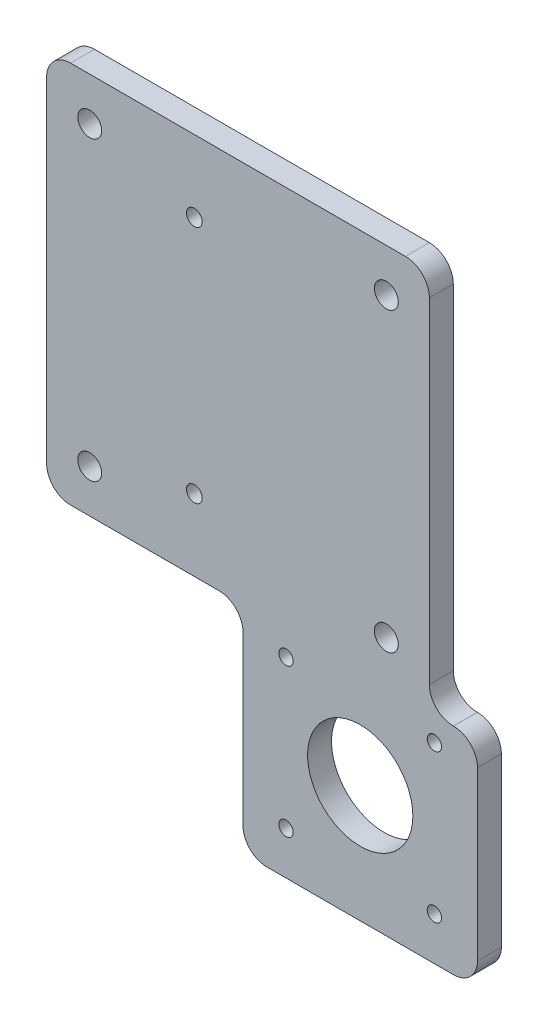
ISO-10303-21;
HEADER;
FILE_DESCRIPTION(('STEP AP214'),'2;1');
FILE_NAME('part.step','',(''),(''),'','','');
FILE_SCHEMA(('AUTOMOTIVE_DESIGN { 1 0 10303 214 1 1 1 1 }'));
ENDSEC;
DATA;
#1=APPLICATION_CONTEXT('core data for automotive mechanical design processes');
#2=APPLICATION_PROTOCOL_DEFINITION('international standard','automotive_design',2000,#1);
#3=PRODUCT_CONTEXT('',#1,'mechanical');
#4=PRODUCT('Part','Part','',(#3));
#5=PRODUCT_RELATED_PRODUCT_CATEGORY('part','',(#4));
#6=PRODUCT_DEFINITION_FORMATION('','',#4);
#7=PRODUCT_DEFINITION_CONTEXT('part definition',#1,'design');
#8=PRODUCT_DEFINITION('design','',#6,#7);
#9=PRODUCT_DEFINITION_SHAPE('','',#8);
#10=(LENGTH_UNIT() NAMED_UNIT(*) SI_UNIT(.MILLI.,.METRE.));
#11=(NAMED_UNIT(*) PLANE_ANGLE_UNIT() SI_UNIT($,.RADIAN.));
#12=(NAMED_UNIT(*) SI_UNIT($,.STERADIAN.) SOLID_ANGLE_UNIT());
#13=UNCERTAINTY_MEASURE_WITH_UNIT(LENGTH_MEASURE(1.E-05),#10,'distance_accuracy_value','');
#14=(GEOMETRIC_REPRESENTATION_CONTEXT(3) GLOBAL_UNCERTAINTY_ASSIGNED_CONTEXT((#13)) GLOBAL_UNIT_ASSIGNED_CONTEXT((#10,
#11,#12)) REPRESENTATION_CONTEXT('',''));
#15=CARTESIAN_POINT('',(0.,0.,0.));
#16=DIRECTION('',(0.,0.,1.));
#17=DIRECTION('',(1.,0.,0.));
#18=AXIS2_PLACEMENT_3D('',#15,#16,#17);
#19=CARTESIAN_POINT('',(0.,0.,5.));
#20=DIRECTION('',(0.,0.,-1.));
#21=DIRECTION('',(-1.,0.,0.));
#22=AXIS2_PLACEMENT_3D('',#19,#20,#21);
#23=PLANE('',#22);
#24=DIRECTION('',(0.,1.,0.));
#25=VECTOR('',#24,1.);
#26=CARTESIAN_POINT('',(90.0437076794254,-45.,5.));
#27=LINE('',#26,#25);
#28=CARTESIAN_POINT('',(90.0437076794254,-40.,5.));
#29=VERTEX_POINT('',#28);
#30=CARTESIAN_POINT('',(90.0437076794254,-5.00000000000001,5.));
#31=VERTEX_POINT('',#30);
#32=EDGE_CURVE('E274',#29,#31,#27,.T.);
#33=ORIENTED_EDGE('',*,*,#32,.T.);
#34=CARTESIAN_POINT('',(85.0437076794254,-5.,5.));
#35=DIRECTION('',(0.,0.,-1.));
#36=DIRECTION('',(-1.,0.,0.));
#37=AXIS2_PLACEMENT_3D('',#34,#35,#36);
#38=CIRCLE('',#37,5.);
#39=CARTESIAN_POINT('',(85.0437076794254,0.,5.));
#40=VERTEX_POINT('',#39);
#41=EDGE_CURVE('E220',#31,#40,#38,.F.);
#42=ORIENTED_EDGE('',*,*,#41,.T.);
#43=DIRECTION('',(-1.,0.,0.));
#44=VECTOR('',#43,1.);
#45=CARTESIAN_POINT('',(90.0437076794254,0.,5.));
#46=LINE('',#45,#44);
#47=CARTESIAN_POINT('',(85.,0.,5.));
#48=VERTEX_POINT('',#47);
#49=EDGE_CURVE('E280',#40,#48,#46,.T.);
#50=ORIENTED_EDGE('',*,*,#49,.T.);
#51=CARTESIAN_POINT('',(85.,5.,5.));
#52=DIRECTION('',(0.,0.,-1.));
#53=DIRECTION('',(-1.,0.,0.));
#54=AXIS2_PLACEMENT_3D('',#51,#52,#53);
#55=CIRCLE('',#54,5.);
#56=CARTESIAN_POINT('',(80.,5.,5.));
#57=VERTEX_POINT('',#56);
#58=EDGE_CURVE('E160',#48,#57,#55,.T.);
#59=ORIENTED_EDGE('',*,*,#58,.T.);
#60=DIRECTION('',(0.,1.,0.));
#61=VECTOR('',#60,1.);
#62=CARTESIAN_POINT('',(80.,0.,5.));
#63=LINE('',#62,#61);
#64=CARTESIAN_POINT('',(80.,75.,5.));
#65=VERTEX_POINT('',#64);
#66=EDGE_CURVE('E170',#57,#65,#63,.T.);
#67=ORIENTED_EDGE('',*,*,#66,.T.);
#68=CARTESIAN_POINT('',(75.,75.,5.));
#69=DIRECTION('',(0.,0.,-1.));
#70=DIRECTION('',(-1.,0.,0.));
#71=AXIS2_PLACEMENT_3D('',#68,#69,#70);
#72=CIRCLE('',#71,5.);
#73=CARTESIAN_POINT('',(75.,80.,5.));
#74=VERTEX_POINT('',#73);
#75=EDGE_CURVE('E217',#65,#74,#72,.F.);
#76=ORIENTED_EDGE('',*,*,#75,.T.);
#77=DIRECTION('',(-1.,0.,0.));
#78=VECTOR('',#77,1.);
#79=CARTESIAN_POINT('',(0.,80.,5.));
#80=LINE('',#79,#78);
#81=CARTESIAN_POINT('',(5.,80.,5.));
#82=VERTEX_POINT('',#81);
#83=EDGE_CURVE('E284',#74,#82,#80,.T.);
#84=ORIENTED_EDGE('',*,*,#83,.T.);
#85=CARTESIAN_POINT('',(5.,75.,5.));
#86=DIRECTION('',(0.,0.,-1.));
#87=DIRECTION('',(-1.,0.,0.));
#88=AXIS2_PLACEMENT_3D('',#85,#86,#87);
#89=CIRCLE('',#88,5.);
#90=CARTESIAN_POINT('',(0.,75.,5.));
#91=VERTEX_POINT('',#90);
#92=EDGE_CURVE('E58',#82,#91,#89,.F.);
#93=ORIENTED_EDGE('',*,*,#92,.T.);
#94=DIRECTION('',(0.,-1.,0.));
#95=VECTOR('',#94,1.);
#96=CARTESIAN_POINT('',(0.,0.,5.));
#97=LINE('',#96,#95);
#98=CARTESIAN_POINT('',(0.,5.,5.));
#99=VERTEX_POINT('',#98);
#100=EDGE_CURVE('E190',#91,#99,#97,.T.);
#101=ORIENTED_EDGE('',*,*,#100,.T.);
#102=CARTESIAN_POINT('',(5.,5.,5.));
#103=DIRECTION('',(0.,0.,-1.));
#104=DIRECTION('',(-1.,0.,0.));
#105=AXIS2_PLACEMENT_3D('',#102,#103,#104);
#106=CIRCLE('',#105,5.);
#107=CARTESIAN_POINT('',(5.,0.,5.));
#108=VERTEX_POINT('',#107);
#109=EDGE_CURVE('E213',#99,#108,#106,.F.);
#110=ORIENTED_EDGE('',*,*,#109,.T.);
#111=DIRECTION('',(1.,0.,0.));
#112=VECTOR('',#111,1.);
#113=CARTESIAN_POINT('',(0.,0.,5.));
#114=LINE('',#113,#112);
#115=CARTESIAN_POINT('',(36.0437076794254,0.,5.));
#116=VERTEX_POINT('',#115);
#117=EDGE_CURVE('E189',#108,#116,#114,.T.);
#118=ORIENTED_EDGE('',*,*,#117,.T.);
#119=CARTESIAN_POINT('',(36.0437076794254,-5.,5.));
#120=DIRECTION('',(0.,0.,-1.));
#121=DIRECTION('',(-1.,0.,0.));
#122=AXIS2_PLACEMENT_3D('',#119,#120,#121);
#123=CIRCLE('',#122,5.);
#124=CARTESIAN_POINT('',(41.0437076794254,-5.,5.));
#125=VERTEX_POINT('',#124);
#126=EDGE_CURVE('E11',#116,#125,#123,.T.);
#127=ORIENTED_EDGE('',*,*,#126,.T.);
#128=DIRECTION('',(0.,-1.,0.));
#129=VECTOR('',#128,1.);
#130=CARTESIAN_POINT('',(41.0437076794254,0.,5.));
#131=LINE('',#130,#129);
#132=CARTESIAN_POINT('',(41.0437076794254,-40.,5.));
#133=VERTEX_POINT('',#132);
#134=EDGE_CURVE('E266',#125,#133,#131,.T.);
#135=ORIENTED_EDGE('',*,*,#134,.T.);
#136=CARTESIAN_POINT('',(46.0437076794254,-40.,5.));
#137=DIRECTION('',(0.,0.,-1.));
#138=DIRECTION('',(-1.,0.,0.));
#139=AXIS2_PLACEMENT_3D('',#136,#137,#138);
#140=CIRCLE('',#139,5.);
#141=CARTESIAN_POINT('',(46.0437076794254,-45.,5.));
#142=VERTEX_POINT('',#141);
#143=EDGE_CURVE('E211',#133,#142,#140,.F.);
#144=ORIENTED_EDGE('',*,*,#143,.T.);
#145=DIRECTION('',(1.,0.,0.));
#146=VECTOR('',#145,1.);
#147=CARTESIAN_POINT('',(41.0437076794254,-45.,5.));
#148=LINE('',#147,#146);
#149=CARTESIAN_POINT('',(85.0437076794253,-45.,5.));
#150=VERTEX_POINT('',#149);
#151=EDGE_CURVE('E271',#142,#150,#148,.T.);
#152=ORIENTED_EDGE('',*,*,#151,.T.);
#153=CARTESIAN_POINT('',(85.0437076794254,-40.,5.));
#154=DIRECTION('',(0.,0.,-1.));
#155=DIRECTION('',(-1.,0.,0.));
#156=AXIS2_PLACEMENT_3D('',#153,#154,#155);
#157=CIRCLE('',#156,5.);
#158=EDGE_CURVE('E215',#150,#29,#157,.F.);
#159=ORIENTED_EDGE('',*,*,#158,.T.);
#160=EDGE_LOOP('',(#33,#42,#50,#59,#67,#76,#84,#93,#101,#110,#118,#127,#135,#144,#152,#159));
#161=FACE_BOUND('',#160,.T.);
#162=CARTESIAN_POINT('',(9.,71.,5.));
#163=DIRECTION('',(0.,0.,1.));
#164=DIRECTION('',(1.,0.,0.));
#165=AXIS2_PLACEMENT_3D('',#162,#163,#164);
#166=CIRCLE('',#165,2.5);
#167=CARTESIAN_POINT('',(11.5,71.,5.));
#168=VERTEX_POINT('',#167);
#169=EDGE_CURVE('E259',#168,#168,#166,.T.);
#170=ORIENTED_EDGE('',*,*,#169,.F.);
#171=EDGE_LOOP('',(#170));
#172=FACE_BOUND('',#171,.T.);
#173=CARTESIAN_POINT('',(71.,71.,5.));
#174=DIRECTION('',(0.,0.,1.));
#175=DIRECTION('',(1.,0.,0.));
#176=AXIS2_PLACEMENT_3D('',#173,#174,#175);
#177=CIRCLE('',#176,2.50000000000001);
#178=CARTESIAN_POINT('',(73.5,71.,5.));
#179=VERTEX_POINT('',#178);
#180=EDGE_CURVE('E567',#179,#179,#177,.T.);
#181=ORIENTED_EDGE('',*,*,#180,.F.);
#182=EDGE_LOOP('',(#181));
#183=FACE_BOUND('',#182,.T.);
#184=CARTESIAN_POINT('',(71.0000000000006,8.99999999999999,5.));
#185=DIRECTION('',(0.,0.,1.));
#186=DIRECTION('',(1.,0.,0.));
#187=AXIS2_PLACEMENT_3D('',#184,#185,#186);
#188=CIRCLE('',#187,2.50000000000001);
#189=CARTESIAN_POINT('',(73.5000000000007,8.99999999999999,5.));
#190=VERTEX_POINT('',#189);
#191=EDGE_CURVE('E574',#190,#190,#188,.T.);
#192=ORIENTED_EDGE('',*,*,#191,.F.);
#193=EDGE_LOOP('',(#192));
#194=FACE_BOUND('',#193,.T.);
#195=CARTESIAN_POINT('',(9.00000000000065,8.99999999999999,5.));
#196=DIRECTION('',(0.,0.,1.));
#197=DIRECTION('',(1.,0.,0.));
#198=AXIS2_PLACEMENT_3D('',#195,#196,#197);
#199=CIRCLE('',#198,2.5);
#200=CARTESIAN_POINT('',(11.5000000000006,8.99999999999999,5.));
#201=VERTEX_POINT('',#200);
#202=EDGE_CURVE('E579',#201,#201,#199,.T.);
#203=ORIENTED_EDGE('',*,*,#202,.F.);
#204=EDGE_LOOP('',(#203));
#205=FACE_BOUND('',#204,.T.);
#206=CARTESIAN_POINT('',(50.0437076794254,-5.,5.));
#207=DIRECTION('',(0.,0.,1.));
#208=DIRECTION('',(1.,0.,0.));
#209=AXIS2_PLACEMENT_3D('',#206,#207,#208);
#210=CIRCLE('',#209,1.5);
#211=CARTESIAN_POINT('',(51.5437076794254,-5.,5.));
#212=VERTEX_POINT('',#211);
#213=EDGE_CURVE('E585',#212,#212,#210,.T.);
#214=ORIENTED_EDGE('',*,*,#213,.F.);
#215=EDGE_LOOP('',(#214));
#216=FACE_BOUND('',#215,.T.);
#217=CARTESIAN_POINT('',(81.0437076794254,-5.,5.));
#218=DIRECTION('',(0.,0.,1.));
#219=DIRECTION('',(1.,0.,0.));
#220=AXIS2_PLACEMENT_3D('',#217,#218,#219);
#221=CIRCLE('',#220,1.5);
#222=CARTESIAN_POINT('',(82.5437076794254,-5.,5.));
#223=VERTEX_POINT('',#222);
#224=EDGE_CURVE('E591',#223,#223,#221,.T.);
#225=ORIENTED_EDGE('',*,*,#224,.F.);
#226=EDGE_LOOP('',(#225));
#227=FACE_BOUND('',#226,.T.);
#228=CARTESIAN_POINT('',(50.0437076794254,-36.,5.));
#229=DIRECTION('',(0.,0.,1.));
#230=DIRECTION('',(1.,0.,0.));
#231=AXIS2_PLACEMENT_3D('',#228,#229,#230);
#232=CIRCLE('',#231,1.5);
#233=CARTESIAN_POINT('',(51.5437076794254,-36.,5.));
#234=VERTEX_POINT('',#233);
#235=EDGE_CURVE('E597',#234,#234,#232,.T.);
#236=ORIENTED_EDGE('',*,*,#235,.F.);
#237=EDGE_LOOP('',(#236));
#238=FACE_BOUND('',#237,.T.);
#239=CARTESIAN_POINT('',(81.0437076794254,-36.,5.));
#240=DIRECTION('',(0.,0.,1.));
#241=DIRECTION('',(1.,0.,0.));
#242=AXIS2_PLACEMENT_3D('',#239,#240,#241);
#243=CIRCLE('',#242,1.5);
#244=CARTESIAN_POINT('',(82.5437076794254,-36.,5.));
#245=VERTEX_POINT('',#244);
#246=EDGE_CURVE('E603',#245,#245,#243,.T.);
#247=ORIENTED_EDGE('',*,*,#246,.F.);
#248=EDGE_LOOP('',(#247));
#249=FACE_BOUND('',#248,.T.);
#250=CARTESIAN_POINT('',(65.5437076794254,-20.5,5.));
#251=DIRECTION('',(0.,0.,1.));
#252=DIRECTION('',(1.,0.,0.));
#253=AXIS2_PLACEMENT_3D('',#250,#251,#252);
#254=CIRCLE('',#253,11.);
#255=CARTESIAN_POINT('',(76.5437076794254,-20.5,5.));
#256=VERTEX_POINT('',#255);
#257=EDGE_CURVE('E609',#256,#256,#254,.T.);
#258=ORIENTED_EDGE('',*,*,#257,.F.);
#259=EDGE_LOOP('',(#258));
#260=FACE_BOUND('',#259,.T.);
#261=CARTESIAN_POINT('',(30.868801214214,15.,5.));
#262=DIRECTION('',(0.,0.,1.));
#263=DIRECTION('',(1.,0.,0.));
#264=AXIS2_PLACEMENT_3D('',#261,#262,#263);
#265=CIRCLE('',#264,1.65);
#266=CARTESIAN_POINT('',(32.518801214214,15.,5.));
#267=VERTEX_POINT('',#266);
#268=EDGE_CURVE('E615',#267,#267,#265,.T.);
#269=ORIENTED_EDGE('',*,*,#268,.F.);
#270=EDGE_LOOP('',(#269));
#271=FACE_BOUND('',#270,.T.);
#272=CARTESIAN_POINT('',(30.868801214214,65.,5.));
#273=DIRECTION('',(0.,0.,1.));
#274=DIRECTION('',(1.,0.,0.));
#275=AXIS2_PLACEMENT_3D('',#272,#273,#274);
#276=CIRCLE('',#275,1.65);
#277=CARTESIAN_POINT('',(32.518801214214,65.,5.));
#278=VERTEX_POINT('',#277);
#279=EDGE_CURVE('E621',#278,#278,#276,.T.);
#280=ORIENTED_EDGE('',*,*,#279,.F.);
#281=EDGE_LOOP('',(#280));
#282=FACE_BOUND('',#281,.T.);
#283=ADVANCED_FACE('F36',(#161,#172,#183,#194,#205,#216,#227,#238,#249,#260,#271,#282),#23,.F.);
#284=CARTESIAN_POINT('',(0.,0.,0.));
#285=DIRECTION('',(0.,0.,-1.));
#286=DIRECTION('',(-1.,0.,0.));
#287=AXIS2_PLACEMENT_3D('',#284,#285,#286);
#288=PLANE('',#287);
#289=CARTESIAN_POINT('',(30.868801214214,15.,0.));
#290=DIRECTION('',(0.,0.,1.));
#291=DIRECTION('',(1.,0.,0.));
#292=AXIS2_PLACEMENT_3D('',#289,#290,#291);
#293=CIRCLE('',#292,1.65);
#294=CARTESIAN_POINT('',(32.518801214214,15.,0.));
#295=VERTEX_POINT('',#294);
#296=EDGE_CURVE('E618',#295,#295,#293,.T.);
#297=ORIENTED_EDGE('',*,*,#296,.T.);
#298=EDGE_LOOP('',(#297));
#299=FACE_BOUND('',#298,.T.);
#300=CARTESIAN_POINT('',(81.0437076794254,-36.,0.));
#301=DIRECTION('',(0.,0.,1.));
#302=DIRECTION('',(1.,0.,0.));
#303=AXIS2_PLACEMENT_3D('',#300,#301,#302);
#304=CIRCLE('',#303,1.5);
#305=CARTESIAN_POINT('',(82.5437076794254,-36.,0.));
#306=VERTEX_POINT('',#305);
#307=EDGE_CURVE('E606',#306,#306,#304,.T.);
#308=ORIENTED_EDGE('',*,*,#307,.T.);
#309=EDGE_LOOP('',(#308));
#310=FACE_BOUND('',#309,.T.);
#311=CARTESIAN_POINT('',(81.0437076794254,-5.,0.));
#312=DIRECTION('',(0.,0.,1.));
#313=DIRECTION('',(1.,0.,0.));
#314=AXIS2_PLACEMENT_3D('',#311,#312,#313);
#315=CIRCLE('',#314,1.5);
#316=CARTESIAN_POINT('',(82.5437076794254,-5.,0.));
#317=VERTEX_POINT('',#316);
#318=EDGE_CURVE('E594',#317,#317,#315,.T.);
#319=ORIENTED_EDGE('',*,*,#318,.T.);
#320=EDGE_LOOP('',(#319));
#321=FACE_BOUND('',#320,.T.);
#322=CARTESIAN_POINT('',(9.00000000000065,8.99999999999999,0.));
#323=DIRECTION('',(0.,0.,1.));
#324=DIRECTION('',(1.,0.,0.));
#325=AXIS2_PLACEMENT_3D('',#322,#323,#324);
#326=CIRCLE('',#325,2.5);
#327=CARTESIAN_POINT('',(11.5000000000006,8.99999999999999,0.));
#328=VERTEX_POINT('',#327);
#329=EDGE_CURVE('E582',#328,#328,#326,.T.);
#330=ORIENTED_EDGE('',*,*,#329,.T.);
#331=EDGE_LOOP('',(#330));
#332=FACE_BOUND('',#331,.T.);
#333=CARTESIAN_POINT('',(71.,71.,0.));
#334=DIRECTION('',(0.,0.,1.));
#335=DIRECTION('',(1.,0.,0.));
#336=AXIS2_PLACEMENT_3D('',#333,#334,#335);
#337=CIRCLE('',#336,2.50000000000001);
#338=CARTESIAN_POINT('',(73.5,71.,0.));
#339=VERTEX_POINT('',#338);
#340=EDGE_CURVE('E570',#339,#339,#337,.T.);
#341=ORIENTED_EDGE('',*,*,#340,.T.);
#342=EDGE_LOOP('',(#341));
#343=FACE_BOUND('',#342,.T.);
#344=DIRECTION('',(-1.,0.,0.));
#345=VECTOR('',#344,1.);
#346=CARTESIAN_POINT('',(90.0437076794254,0.,0.));
#347=LINE('',#346,#345);
#348=CARTESIAN_POINT('',(85.0437076794254,0.,0.));
#349=VERTEX_POINT('',#348);
#350=CARTESIAN_POINT('',(85.,0.,0.));
#351=VERTEX_POINT('',#350);
#352=EDGE_CURVE('E179',#349,#351,#347,.T.);
#353=ORIENTED_EDGE('',*,*,#352,.F.);
#354=CARTESIAN_POINT('',(85.0437076794254,-5.,0.));
#355=DIRECTION('',(0.,0.,-1.));
#356=DIRECTION('',(-1.,0.,0.));
#357=AXIS2_PLACEMENT_3D('',#354,#355,#356);
#358=CIRCLE('',#357,5.);
#359=CARTESIAN_POINT('',(90.0437076794254,-5.00000000000001,0.));
#360=VERTEX_POINT('',#359);
#361=EDGE_CURVE('E204',#349,#360,#358,.T.);
#362=ORIENTED_EDGE('',*,*,#361,.T.);
#363=DIRECTION('',(0.,1.,0.));
#364=VECTOR('',#363,1.);
#365=CARTESIAN_POINT('',(90.0437076794254,-45.,0.));
#366=LINE('',#365,#364);
#367=CARTESIAN_POINT('',(90.0437076794254,-40.,0.));
#368=VERTEX_POINT('',#367);
#369=EDGE_CURVE('E184',#368,#360,#366,.T.);
#370=ORIENTED_EDGE('',*,*,#369,.F.);
#371=CARTESIAN_POINT('',(85.0437076794254,-40.,0.));
#372=DIRECTION('',(0.,0.,-1.));
#373=DIRECTION('',(-1.,0.,0.));
#374=AXIS2_PLACEMENT_3D('',#371,#372,#373);
#375=CIRCLE('',#374,5.);
#376=CARTESIAN_POINT('',(85.0437076794253,-45.,0.));
#377=VERTEX_POINT('',#376);
#378=EDGE_CURVE('E199',#368,#377,#375,.T.);
#379=ORIENTED_EDGE('',*,*,#378,.T.);
#380=DIRECTION('',(1.,0.,0.));
#381=VECTOR('',#380,1.);
#382=CARTESIAN_POINT('',(41.0437076794254,-45.,0.));
#383=LINE('',#382,#381);
#384=CARTESIAN_POINT('',(46.0437076794254,-45.,0.));
#385=VERTEX_POINT('',#384);
#386=EDGE_CURVE('E288',#385,#377,#383,.T.);
#387=ORIENTED_EDGE('',*,*,#386,.F.);
#388=CARTESIAN_POINT('',(46.0437076794254,-40.,0.));
#389=DIRECTION('',(0.,0.,-1.));
#390=DIRECTION('',(-1.,0.,0.));
#391=AXIS2_PLACEMENT_3D('',#388,#389,#390);
#392=CIRCLE('',#391,5.);
#393=CARTESIAN_POINT('',(41.0437076794254,-40.,0.));
#394=VERTEX_POINT('',#393);
#395=EDGE_CURVE('E195',#385,#394,#392,.T.);
#396=ORIENTED_EDGE('',*,*,#395,.T.);
#397=DIRECTION('',(0.,-1.,0.));
#398=VECTOR('',#397,1.);
#399=CARTESIAN_POINT('',(41.0437076794254,0.,0.));
#400=LINE('',#399,#398);
#401=CARTESIAN_POINT('',(41.0437076794254,-5.,0.));
#402=VERTEX_POINT('',#401);
#403=EDGE_CURVE('E250',#402,#394,#400,.T.);
#404=ORIENTED_EDGE('',*,*,#403,.F.);
#405=CARTESIAN_POINT('',(36.0437076794254,-5.,0.));
#406=DIRECTION('',(0.,0.,-1.));
#407=DIRECTION('',(-1.,0.,0.));
#408=AXIS2_PLACEMENT_3D('',#405,#406,#407);
#409=CIRCLE('',#408,5.);
#410=CARTESIAN_POINT('',(36.0437076794254,0.,0.));
#411=VERTEX_POINT('',#410);
#412=EDGE_CURVE('E44',#402,#411,#409,.F.);
#413=ORIENTED_EDGE('',*,*,#412,.T.);
#414=DIRECTION('',(1.,0.,0.));
#415=VECTOR('',#414,1.);
#416=CARTESIAN_POINT('',(0.,0.,0.));
#417=LINE('',#416,#415);
#418=CARTESIAN_POINT('',(5.,0.,0.));
#419=VERTEX_POINT('',#418);
#420=EDGE_CURVE('E248',#419,#411,#417,.T.);
#421=ORIENTED_EDGE('',*,*,#420,.F.);
#422=CARTESIAN_POINT('',(5.,5.,0.));
#423=DIRECTION('',(0.,0.,-1.));
#424=DIRECTION('',(-1.,0.,0.));
#425=AXIS2_PLACEMENT_3D('',#422,#423,#424);
#426=CIRCLE('',#425,5.);
#427=CARTESIAN_POINT('',(0.,5.,0.));
#428=VERTEX_POINT('',#427);
#429=EDGE_CURVE('E197',#419,#428,#426,.T.);
#430=ORIENTED_EDGE('',*,*,#429,.T.);
#431=DIRECTION('',(0.,-1.,0.));
#432=VECTOR('',#431,1.);
#433=CARTESIAN_POINT('',(0.,0.,0.));
#434=LINE('',#433,#432);
#435=CARTESIAN_POINT('',(0.,75.,0.));
#436=VERTEX_POINT('',#435);
#437=EDGE_CURVE('E182',#436,#428,#434,.T.);
#438=ORIENTED_EDGE('',*,*,#437,.F.);
#439=CARTESIAN_POINT('',(5.,75.,0.));
#440=DIRECTION('',(0.,0.,-1.));
#441=DIRECTION('',(-1.,0.,0.));
#442=AXIS2_PLACEMENT_3D('',#439,#440,#441);
#443=CIRCLE('',#442,5.);
#444=CARTESIAN_POINT('',(5.,80.,0.));
#445=VERTEX_POINT('',#444);
#446=EDGE_CURVE('E202',#436,#445,#443,.T.);
#447=ORIENTED_EDGE('',*,*,#446,.T.);
#448=DIRECTION('',(-1.,0.,0.));
#449=VECTOR('',#448,1.);
#450=CARTESIAN_POINT('',(0.,80.,0.));
#451=LINE('',#450,#449);
#452=CARTESIAN_POINT('',(75.,80.,0.));
#453=VERTEX_POINT('',#452);
#454=EDGE_CURVE('E178',#453,#445,#451,.T.);
#455=ORIENTED_EDGE('',*,*,#454,.F.);
#456=CARTESIAN_POINT('',(75.,75.,0.));
#457=DIRECTION('',(0.,0.,-1.));
#458=DIRECTION('',(-1.,0.,0.));
#459=AXIS2_PLACEMENT_3D('',#456,#457,#458);
#460=CIRCLE('',#459,5.);
#461=CARTESIAN_POINT('',(80.,75.,0.));
#462=VERTEX_POINT('',#461);
#463=EDGE_CURVE('E177',#453,#462,#460,.T.);
#464=ORIENTED_EDGE('',*,*,#463,.T.);
#465=DIRECTION('',(0.,1.,0.));
#466=VECTOR('',#465,1.);
#467=CARTESIAN_POINT('',(80.,0.,0.));
#468=LINE('',#467,#466);
#469=CARTESIAN_POINT('',(80.,5.,0.));
#470=VERTEX_POINT('',#469);
#471=EDGE_CURVE('E167',#470,#462,#468,.T.);
#472=ORIENTED_EDGE('',*,*,#471,.F.);
#473=CARTESIAN_POINT('',(85.,5.,0.));
#474=DIRECTION('',(0.,0.,-1.));
#475=DIRECTION('',(-1.,0.,0.));
#476=AXIS2_PLACEMENT_3D('',#473,#474,#475);
#477=CIRCLE('',#476,5.);
#478=EDGE_CURVE('E150',#470,#351,#477,.F.);
#479=ORIENTED_EDGE('',*,*,#478,.T.);
#480=EDGE_LOOP('',(#353,#362,#370,#379,#387,#396,#404,#413,#421,#430,#438,#447,#455,#464,#472,#479));
#481=FACE_BOUND('',#480,.T.);
#482=CARTESIAN_POINT('',(9.,71.,0.));
#483=DIRECTION('',(0.,0.,1.));
#484=DIRECTION('',(1.,0.,0.));
#485=AXIS2_PLACEMENT_3D('',#482,#483,#484);
#486=CIRCLE('',#485,2.5);
#487=CARTESIAN_POINT('',(11.5,71.,0.));
#488=VERTEX_POINT('',#487);
#489=EDGE_CURVE('E566',#488,#488,#486,.T.);
#490=ORIENTED_EDGE('',*,*,#489,.T.);
#491=EDGE_LOOP('',(#490));
#492=FACE_BOUND('',#491,.T.);
#493=CARTESIAN_POINT('',(71.0000000000006,8.99999999999999,0.));
#494=DIRECTION('',(0.,0.,1.));
#495=DIRECTION('',(1.,0.,0.));
#496=AXIS2_PLACEMENT_3D('',#493,#494,#495);
#497=CIRCLE('',#496,2.50000000000001);
#498=CARTESIAN_POINT('',(73.5000000000007,8.99999999999999,0.));
#499=VERTEX_POINT('',#498);
#500=EDGE_CURVE('E576',#499,#499,#497,.T.);
#501=ORIENTED_EDGE('',*,*,#500,.T.);
#502=EDGE_LOOP('',(#501));
#503=FACE_BOUND('',#502,.T.);
#504=CARTESIAN_POINT('',(50.0437076794254,-5.,0.));
#505=DIRECTION('',(0.,0.,1.));
#506=DIRECTION('',(1.,0.,0.));
#507=AXIS2_PLACEMENT_3D('',#504,#505,#506);
#508=CIRCLE('',#507,1.5);
#509=CARTESIAN_POINT('',(51.5437076794254,-5.,0.));
#510=VERTEX_POINT('',#509);
#511=EDGE_CURVE('E588',#510,#510,#508,.T.);
#512=ORIENTED_EDGE('',*,*,#511,.T.);
#513=EDGE_LOOP('',(#512));
#514=FACE_BOUND('',#513,.T.);
#515=CARTESIAN_POINT('',(50.0437076794254,-36.,0.));
#516=DIRECTION('',(0.,0.,1.));
#517=DIRECTION('',(1.,0.,0.));
#518=AXIS2_PLACEMENT_3D('',#515,#516,#517);
#519=CIRCLE('',#518,1.5);
#520=CARTESIAN_POINT('',(51.5437076794254,-36.,0.));
#521=VERTEX_POINT('',#520);
#522=EDGE_CURVE('E600',#521,#521,#519,.T.);
#523=ORIENTED_EDGE('',*,*,#522,.T.);
#524=EDGE_LOOP('',(#523));
#525=FACE_BOUND('',#524,.T.);
#526=CARTESIAN_POINT('',(65.5437076794254,-20.5,0.));
#527=DIRECTION('',(0.,0.,1.));
#528=DIRECTION('',(1.,0.,0.));
#529=AXIS2_PLACEMENT_3D('',#526,#527,#528);
#530=CIRCLE('',#529,11.);
#531=CARTESIAN_POINT('',(76.5437076794254,-20.5,0.));
#532=VERTEX_POINT('',#531);
#533=EDGE_CURVE('E612',#532,#532,#530,.T.);
#534=ORIENTED_EDGE('',*,*,#533,.T.);
#535=EDGE_LOOP('',(#534));
#536=FACE_BOUND('',#535,.T.);
#537=CARTESIAN_POINT('',(30.868801214214,65.,0.));
#538=DIRECTION('',(0.,0.,1.));
#539=DIRECTION('',(1.,0.,0.));
#540=AXIS2_PLACEMENT_3D('',#537,#538,#539);
#541=CIRCLE('',#540,1.65);
#542=CARTESIAN_POINT('',(32.518801214214,65.,0.));
#543=VERTEX_POINT('',#542);
#544=EDGE_CURVE('E624',#543,#543,#541,.T.);
#545=ORIENTED_EDGE('',*,*,#544,.T.);
#546=EDGE_LOOP('',(#545));
#547=FACE_BOUND('',#546,.T.);
#548=ADVANCED_FACE('F174',(#299,#310,#321,#332,#343,#481,#492,#503,#514,#525,#536,#547),#288,.T.);
#549=CARTESIAN_POINT('',(0.,0.,5.));
#550=DIRECTION('',(0.,1.,0.));
#551=DIRECTION('',(0.,0.,1.));
#552=AXIS2_PLACEMENT_3D('',#549,#550,#551);
#553=PLANE('',#552);
#554=ORIENTED_EDGE('',*,*,#117,.F.);
#555=DIRECTION('',(0.,0.,-1.));
#556=VECTOR('',#555,1.);
#557=CARTESIAN_POINT('',(5.,0.,5.));
#558=LINE('',#557,#556);
#559=EDGE_CURVE('E238',#108,#419,#558,.T.);
#560=ORIENTED_EDGE('',*,*,#559,.T.);
#561=ORIENTED_EDGE('',*,*,#420,.T.);
#562=DIRECTION('',(0.,0.,-1.));
#563=VECTOR('',#562,1.);
#564=CARTESIAN_POINT('',(36.0437076794254,0.,5.));
#565=LINE('',#564,#563);
#566=EDGE_CURVE('E236',#411,#116,#565,.F.);
#567=ORIENTED_EDGE('',*,*,#566,.T.);
#568=EDGE_LOOP('',(#554,#560,#561,#567));
#569=FACE_BOUND('',#568,.T.);
#570=ADVANCED_FACE('F256',(#569),#553,.F.);
#571=CARTESIAN_POINT('',(41.0437076794254,0.,5.));
#572=DIRECTION('',(1.,0.,0.));
#573=DIRECTION('',(0.,1.,0.));
#574=AXIS2_PLACEMENT_3D('',#571,#572,#573);
#575=PLANE('',#574);
#576=ORIENTED_EDGE('',*,*,#403,.T.);
#577=DIRECTION('',(0.,0.,-1.));
#578=VECTOR('',#577,1.);
#579=CARTESIAN_POINT('',(41.0437076794254,-40.,5.));
#580=LINE('',#579,#578);
#581=EDGE_CURVE('E161',#394,#133,#580,.F.);
#582=ORIENTED_EDGE('',*,*,#581,.T.);
#583=ORIENTED_EDGE('',*,*,#134,.F.);
#584=DIRECTION('',(0.,0.,-1.));
#585=VECTOR('',#584,1.);
#586=CARTESIAN_POINT('',(41.0437076794254,-5.,0.));
#587=LINE('',#586,#585);
#588=EDGE_CURVE('E241',#125,#402,#587,.T.);
#589=ORIENTED_EDGE('',*,*,#588,.T.);
#590=EDGE_LOOP('',(#576,#582,#583,#589));
#591=FACE_BOUND('',#590,.T.);
#592=ADVANCED_FACE('F269',(#591),#575,.F.);
#593=CARTESIAN_POINT('',(41.0437076794254,-45.,5.));
#594=DIRECTION('',(0.,1.,0.));
#595=DIRECTION('',(0.,0.,1.));
#596=AXIS2_PLACEMENT_3D('',#593,#594,#595);
#597=PLANE('',#596);
#598=ORIENTED_EDGE('',*,*,#386,.T.);
#599=DIRECTION('',(0.,0.,-1.));
#600=VECTOR('',#599,1.);
#601=CARTESIAN_POINT('',(85.0437076794254,-45.,5.));
#602=LINE('',#601,#600);
#603=EDGE_CURVE('E234',#377,#150,#602,.F.);
#604=ORIENTED_EDGE('',*,*,#603,.T.);
#605=ORIENTED_EDGE('',*,*,#151,.F.);
#606=DIRECTION('',(0.,0.,-1.));
#607=VECTOR('',#606,1.);
#608=CARTESIAN_POINT('',(46.0437076794254,-45.,5.));
#609=LINE('',#608,#607);
#610=EDGE_CURVE('E231',#142,#385,#609,.T.);
#611=ORIENTED_EDGE('',*,*,#610,.T.);
#612=EDGE_LOOP('',(#598,#604,#605,#611));
#613=FACE_BOUND('',#612,.T.);
#614=ADVANCED_FACE('F312',(#613),#597,.F.);
#615=CARTESIAN_POINT('',(90.0437076794254,-45.,5.));
#616=DIRECTION('',(-1.,0.,0.));
#617=DIRECTION('',(0.,0.,1.));
#618=AXIS2_PLACEMENT_3D('',#615,#616,#617);
#619=PLANE('',#618);
#620=ORIENTED_EDGE('',*,*,#369,.T.);
#621=DIRECTION('',(0.,0.,-1.));
#622=VECTOR('',#621,1.);
#623=CARTESIAN_POINT('',(90.0437076794254,-5.,5.));
#624=LINE('',#623,#622);
#625=EDGE_CURVE('E209',#360,#31,#624,.F.);
#626=ORIENTED_EDGE('',*,*,#625,.T.);
#627=ORIENTED_EDGE('',*,*,#32,.F.);
#628=DIRECTION('',(0.,0.,-1.));
#629=VECTOR('',#628,1.);
#630=CARTESIAN_POINT('',(90.0437076794254,-40.,5.));
#631=LINE('',#630,#629);
#632=EDGE_CURVE('E206',#29,#368,#631,.T.);
#633=ORIENTED_EDGE('',*,*,#632,.T.);
#634=EDGE_LOOP('',(#620,#626,#627,#633));
#635=FACE_BOUND('',#634,.T.);
#636=ADVANCED_FACE('F294',(#635),#619,.F.);
#637=CARTESIAN_POINT('',(90.0437076794254,0.,5.));
#638=DIRECTION('',(0.,-1.,0.));
#639=DIRECTION('',(1.,0.,0.));
#640=AXIS2_PLACEMENT_3D('',#637,#638,#639);
#641=PLANE('',#640);
#642=ORIENTED_EDGE('',*,*,#352,.T.);
#643=DIRECTION('',(0.,0.,-1.));
#644=VECTOR('',#643,1.);
#645=CARTESIAN_POINT('',(85.,0.,5.));
#646=LINE('',#645,#644);
#647=EDGE_CURVE('E155',#351,#48,#646,.F.);
#648=ORIENTED_EDGE('',*,*,#647,.T.);
#649=ORIENTED_EDGE('',*,*,#49,.F.);
#650=DIRECTION('',(0.,0.,-1.));
#651=VECTOR('',#650,1.);
#652=CARTESIAN_POINT('',(85.0437076794254,0.,5.));
#653=LINE('',#652,#651);
#654=EDGE_CURVE('E171',#40,#349,#653,.T.);
#655=ORIENTED_EDGE('',*,*,#654,.T.);
#656=EDGE_LOOP('',(#642,#648,#649,#655));
#657=FACE_BOUND('',#656,.T.);
#658=ADVANCED_FACE('F303',(#657),#641,.F.);
#659=CARTESIAN_POINT('',(80.,0.,5.));
#660=DIRECTION('',(-1.,0.,0.));
#661=DIRECTION('',(0.,0.,1.));
#662=AXIS2_PLACEMENT_3D('',#659,#660,#661);
#663=PLANE('',#662);
#664=ORIENTED_EDGE('',*,*,#66,.F.);
#665=DIRECTION('',(0.,0.,-1.));
#666=VECTOR('',#665,1.);
#667=CARTESIAN_POINT('',(80.,5.,0.));
#668=LINE('',#667,#666);
#669=EDGE_CURVE('E154',#57,#470,#668,.T.);
#670=ORIENTED_EDGE('',*,*,#669,.T.);
#671=ORIENTED_EDGE('',*,*,#471,.T.);
#672=DIRECTION('',(0.,0.,-1.));
#673=VECTOR('',#672,1.);
#674=CARTESIAN_POINT('',(80.,75.,5.));
#675=LINE('',#674,#673);
#676=EDGE_CURVE('E172',#462,#65,#675,.F.);
#677=ORIENTED_EDGE('',*,*,#676,.T.);
#678=EDGE_LOOP('',(#664,#670,#671,#677));
#679=FACE_BOUND('',#678,.T.);
#680=ADVANCED_FACE('F166',(#679),#663,.F.);
#681=CARTESIAN_POINT('',(0.,80.,5.));
#682=DIRECTION('',(0.,-1.,0.));
#683=DIRECTION('',(0.,0.,-1.));
#684=AXIS2_PLACEMENT_3D('',#681,#682,#683);
#685=PLANE('',#684);
#686=ORIENTED_EDGE('',*,*,#454,.T.);
#687=DIRECTION('',(0.,0.,-1.));
#688=VECTOR('',#687,1.);
#689=CARTESIAN_POINT('',(5.,80.,5.));
#690=LINE('',#689,#688);
#691=EDGE_CURVE('E229',#445,#82,#690,.F.);
#692=ORIENTED_EDGE('',*,*,#691,.T.);
#693=ORIENTED_EDGE('',*,*,#83,.F.);
#694=DIRECTION('',(0.,0.,-1.));
#695=VECTOR('',#694,1.);
#696=CARTESIAN_POINT('',(75.,80.,5.));
#697=LINE('',#696,#695);
#698=EDGE_CURVE('E226',#74,#453,#697,.T.);
#699=ORIENTED_EDGE('',*,*,#698,.T.);
#700=EDGE_LOOP('',(#686,#692,#693,#699));
#701=FACE_BOUND('',#700,.T.);
#702=ADVANCED_FACE('F310',(#701),#685,.F.);
#703=CARTESIAN_POINT('',(0.,0.,5.));
#704=DIRECTION('',(1.,0.,0.));
#705=DIRECTION('',(0.,0.,-1.));
#706=AXIS2_PLACEMENT_3D('',#703,#704,#705);
#707=PLANE('',#706);
#708=ORIENTED_EDGE('',*,*,#100,.F.);
#709=DIRECTION('',(0.,0.,-1.));
#710=VECTOR('',#709,1.);
#711=CARTESIAN_POINT('',(0.,75.,5.));
#712=LINE('',#711,#710);
#713=EDGE_CURVE('E223',#91,#436,#712,.T.);
#714=ORIENTED_EDGE('',*,*,#713,.T.);
#715=ORIENTED_EDGE('',*,*,#437,.T.);
#716=DIRECTION('',(0.,0.,-1.));
#717=VECTOR('',#716,1.);
#718=CARTESIAN_POINT('',(0.,5.,5.));
#719=LINE('',#718,#717);
#720=EDGE_CURVE('E51',#428,#99,#719,.F.);
#721=ORIENTED_EDGE('',*,*,#720,.T.);
#722=EDGE_LOOP('',(#708,#714,#715,#721));
#723=FACE_BOUND('',#722,.T.);
#724=ADVANCED_FACE('F325',(#723),#707,.F.);
#725=CARTESIAN_POINT('',(9.,71.,5.));
#726=DIRECTION('',(0.,0.,-1.));
#727=DIRECTION('',(-1.,0.,0.));
#728=AXIS2_PLACEMENT_3D('',#725,#726,#727);
#729=CYLINDRICAL_SURFACE('',#728,2.5);
#730=ORIENTED_EDGE('',*,*,#169,.T.);
#731=EDGE_LOOP('',(#730));
#732=FACE_BOUND('',#731,.T.);
#733=ORIENTED_EDGE('',*,*,#489,.F.);
#734=EDGE_LOOP('',(#733));
#735=FACE_BOUND('',#734,.T.);
#736=ADVANCED_FACE('F322',(#732,#735),#729,.F.);
#737=CARTESIAN_POINT('',(71.,71.,5.));
#738=DIRECTION('',(0.,0.,-1.));
#739=DIRECTION('',(-1.,0.,0.));
#740=AXIS2_PLACEMENT_3D('',#737,#738,#739);
#741=CYLINDRICAL_SURFACE('',#740,2.50000000000001);
#742=ORIENTED_EDGE('',*,*,#180,.T.);
#743=EDGE_LOOP('',(#742));
#744=FACE_BOUND('',#743,.T.);
#745=ORIENTED_EDGE('',*,*,#340,.F.);
#746=EDGE_LOOP('',(#745));
#747=FACE_BOUND('',#746,.T.);
#748=ADVANCED_FACE('F525',(#744,#747),#741,.F.);
#749=CARTESIAN_POINT('',(71.0000000000006,8.99999999999999,5.));
#750=DIRECTION('',(0.,0.,-1.));
#751=DIRECTION('',(-1.,0.,0.));
#752=AXIS2_PLACEMENT_3D('',#749,#750,#751);
#753=CYLINDRICAL_SURFACE('',#752,2.50000000000001);
#754=ORIENTED_EDGE('',*,*,#191,.T.);
#755=EDGE_LOOP('',(#754));
#756=FACE_BOUND('',#755,.T.);
#757=ORIENTED_EDGE('',*,*,#500,.F.);
#758=EDGE_LOOP('',(#757));
#759=FACE_BOUND('',#758,.T.);
#760=ADVANCED_FACE('F517',(#756,#759),#753,.F.);
#761=CARTESIAN_POINT('',(9.00000000000065,8.99999999999999,5.));
#762=DIRECTION('',(0.,0.,-1.));
#763=DIRECTION('',(-1.,0.,0.));
#764=AXIS2_PLACEMENT_3D('',#761,#762,#763);
#765=CYLINDRICAL_SURFACE('',#764,2.5);
#766=ORIENTED_EDGE('',*,*,#202,.T.);
#767=EDGE_LOOP('',(#766));
#768=FACE_BOUND('',#767,.T.);
#769=ORIENTED_EDGE('',*,*,#329,.F.);
#770=EDGE_LOOP('',(#769));
#771=FACE_BOUND('',#770,.T.);
#772=ADVANCED_FACE('F509',(#768,#771),#765,.F.);
#773=CARTESIAN_POINT('',(50.0437076794254,-5.,5.));
#774=DIRECTION('',(0.,0.,-1.));
#775=DIRECTION('',(-1.,0.,0.));
#776=AXIS2_PLACEMENT_3D('',#773,#774,#775);
#777=CYLINDRICAL_SURFACE('',#776,1.5);
#778=ORIENTED_EDGE('',*,*,#213,.T.);
#779=EDGE_LOOP('',(#778));
#780=FACE_BOUND('',#779,.T.);
#781=ORIENTED_EDGE('',*,*,#511,.F.);
#782=EDGE_LOOP('',(#781));
#783=FACE_BOUND('',#782,.T.);
#784=ADVANCED_FACE('F501',(#780,#783),#777,.F.);
#785=CARTESIAN_POINT('',(81.0437076794254,-5.,5.));
#786=DIRECTION('',(0.,0.,-1.));
#787=DIRECTION('',(-1.,0.,0.));
#788=AXIS2_PLACEMENT_3D('',#785,#786,#787);
#789=CYLINDRICAL_SURFACE('',#788,1.5);
#790=ORIENTED_EDGE('',*,*,#224,.T.);
#791=EDGE_LOOP('',(#790));
#792=FACE_BOUND('',#791,.T.);
#793=ORIENTED_EDGE('',*,*,#318,.F.);
#794=EDGE_LOOP('',(#793));
#795=FACE_BOUND('',#794,.T.);
#796=ADVANCED_FACE('F493',(#792,#795),#789,.F.);
#797=CARTESIAN_POINT('',(50.0437076794254,-36.,5.));
#798=DIRECTION('',(0.,0.,-1.));
#799=DIRECTION('',(-1.,0.,0.));
#800=AXIS2_PLACEMENT_3D('',#797,#798,#799);
#801=CYLINDRICAL_SURFACE('',#800,1.5);
#802=ORIENTED_EDGE('',*,*,#235,.T.);
#803=EDGE_LOOP('',(#802));
#804=FACE_BOUND('',#803,.T.);
#805=ORIENTED_EDGE('',*,*,#522,.F.);
#806=EDGE_LOOP('',(#805));
#807=FACE_BOUND('',#806,.T.);
#808=ADVANCED_FACE('F485',(#804,#807),#801,.F.);
#809=CARTESIAN_POINT('',(81.0437076794254,-36.,5.));
#810=DIRECTION('',(0.,0.,-1.));
#811=DIRECTION('',(-1.,0.,0.));
#812=AXIS2_PLACEMENT_3D('',#809,#810,#811);
#813=CYLINDRICAL_SURFACE('',#812,1.5);
#814=ORIENTED_EDGE('',*,*,#246,.T.);
#815=EDGE_LOOP('',(#814));
#816=FACE_BOUND('',#815,.T.);
#817=ORIENTED_EDGE('',*,*,#307,.F.);
#818=EDGE_LOOP('',(#817));
#819=FACE_BOUND('',#818,.T.);
#820=ADVANCED_FACE('F477',(#816,#819),#813,.F.);
#821=CARTESIAN_POINT('',(65.5437076794254,-20.5,5.));
#822=DIRECTION('',(0.,0.,-1.));
#823=DIRECTION('',(-1.,0.,0.));
#824=AXIS2_PLACEMENT_3D('',#821,#822,#823);
#825=CYLINDRICAL_SURFACE('',#824,11.);
#826=ORIENTED_EDGE('',*,*,#257,.T.);
#827=EDGE_LOOP('',(#826));
#828=FACE_BOUND('',#827,.T.);
#829=ORIENTED_EDGE('',*,*,#533,.F.);
#830=EDGE_LOOP('',(#829));
#831=FACE_BOUND('',#830,.T.);
#832=ADVANCED_FACE('F469',(#828,#831),#825,.F.);
#833=CARTESIAN_POINT('',(30.868801214214,15.,5.));
#834=DIRECTION('',(0.,0.,-1.));
#835=DIRECTION('',(-1.,0.,0.));
#836=AXIS2_PLACEMENT_3D('',#833,#834,#835);
#837=CYLINDRICAL_SURFACE('',#836,1.65);
#838=ORIENTED_EDGE('',*,*,#268,.T.);
#839=EDGE_LOOP('',(#838));
#840=FACE_BOUND('',#839,.T.);
#841=ORIENTED_EDGE('',*,*,#296,.F.);
#842=EDGE_LOOP('',(#841));
#843=FACE_BOUND('',#842,.T.);
#844=ADVANCED_FACE('F462',(#840,#843),#837,.F.);
#845=CARTESIAN_POINT('',(30.868801214214,65.,5.));
#846=DIRECTION('',(0.,0.,-1.));
#847=DIRECTION('',(-1.,0.,0.));
#848=AXIS2_PLACEMENT_3D('',#845,#846,#847);
#849=CYLINDRICAL_SURFACE('',#848,1.65);
#850=ORIENTED_EDGE('',*,*,#279,.T.);
#851=EDGE_LOOP('',(#850));
#852=FACE_BOUND('',#851,.T.);
#853=ORIENTED_EDGE('',*,*,#544,.F.);
#854=EDGE_LOOP('',(#853));
#855=FACE_BOUND('',#854,.T.);
#856=ADVANCED_FACE('F364',(#852,#855),#849,.F.);
#857=CARTESIAN_POINT('',(85.,5.,5.));
#858=DIRECTION('',(0.,0.,1.));
#859=DIRECTION('',(1.,0.,0.));
#860=AXIS2_PLACEMENT_3D('',#857,#858,#859);
#861=CYLINDRICAL_SURFACE('',#860,5.);
#862=ORIENTED_EDGE('',*,*,#58,.F.);
#863=ORIENTED_EDGE('',*,*,#647,.F.);
#864=ORIENTED_EDGE('',*,*,#478,.F.);
#865=ORIENTED_EDGE('',*,*,#669,.F.);
#866=EDGE_LOOP('',(#862,#863,#864,#865));
#867=FACE_BOUND('',#866,.T.);
#868=ADVANCED_FACE('F153',(#867),#861,.F.);
#869=CARTESIAN_POINT('',(85.0437076794254,-5.,5.));
#870=DIRECTION('',(0.,0.,-1.));
#871=DIRECTION('',(-1.,0.,0.));
#872=AXIS2_PLACEMENT_3D('',#869,#870,#871);
#873=CYLINDRICAL_SURFACE('',#872,5.);
#874=ORIENTED_EDGE('',*,*,#41,.F.);
#875=ORIENTED_EDGE('',*,*,#625,.F.);
#876=ORIENTED_EDGE('',*,*,#361,.F.);
#877=ORIENTED_EDGE('',*,*,#654,.F.);
#878=EDGE_LOOP('',(#874,#875,#876,#877));
#879=FACE_BOUND('',#878,.T.);
#880=ADVANCED_FACE('F299',(#879),#873,.T.);
#881=CARTESIAN_POINT('',(5.,75.,5.));
#882=DIRECTION('',(0.,0.,-1.));
#883=DIRECTION('',(-1.,0.,0.));
#884=AXIS2_PLACEMENT_3D('',#881,#882,#883);
#885=CYLINDRICAL_SURFACE('',#884,5.);
#886=ORIENTED_EDGE('',*,*,#92,.F.);
#887=ORIENTED_EDGE('',*,*,#691,.F.);
#888=ORIENTED_EDGE('',*,*,#446,.F.);
#889=ORIENTED_EDGE('',*,*,#713,.F.);
#890=EDGE_LOOP('',(#886,#887,#888,#889));
#891=FACE_BOUND('',#890,.T.);
#892=ADVANCED_FACE('F336',(#891),#885,.T.);
#893=CARTESIAN_POINT('',(75.,75.,5.));
#894=DIRECTION('',(0.,0.,-1.));
#895=DIRECTION('',(-1.,0.,0.));
#896=AXIS2_PLACEMENT_3D('',#893,#894,#895);
#897=CYLINDRICAL_SURFACE('',#896,5.);
#898=ORIENTED_EDGE('',*,*,#75,.F.);
#899=ORIENTED_EDGE('',*,*,#676,.F.);
#900=ORIENTED_EDGE('',*,*,#463,.F.);
#901=ORIENTED_EDGE('',*,*,#698,.F.);
#902=EDGE_LOOP('',(#898,#899,#900,#901));
#903=FACE_BOUND('',#902,.T.);
#904=ADVANCED_FACE('F351',(#903),#897,.T.);
#905=CARTESIAN_POINT('',(85.0437076794254,-40.,5.));
#906=DIRECTION('',(0.,0.,-1.));
#907=DIRECTION('',(-1.,0.,0.));
#908=AXIS2_PLACEMENT_3D('',#905,#906,#907);
#909=CYLINDRICAL_SURFACE('',#908,5.);
#910=ORIENTED_EDGE('',*,*,#158,.F.);
#911=ORIENTED_EDGE('',*,*,#603,.F.);
#912=ORIENTED_EDGE('',*,*,#378,.F.);
#913=ORIENTED_EDGE('',*,*,#632,.F.);
#914=EDGE_LOOP('',(#910,#911,#912,#913));
#915=FACE_BOUND('',#914,.T.);
#916=ADVANCED_FACE('F344',(#915),#909,.T.);
#917=CARTESIAN_POINT('',(5.,5.,5.));
#918=DIRECTION('',(0.,0.,-1.));
#919=DIRECTION('',(-1.,0.,0.));
#920=AXIS2_PLACEMENT_3D('',#917,#918,#919);
#921=CYLINDRICAL_SURFACE('',#920,5.);
#922=ORIENTED_EDGE('',*,*,#109,.F.);
#923=ORIENTED_EDGE('',*,*,#720,.F.);
#924=ORIENTED_EDGE('',*,*,#429,.F.);
#925=ORIENTED_EDGE('',*,*,#559,.F.);
#926=EDGE_LOOP('',(#922,#923,#924,#925));
#927=FACE_BOUND('',#926,.T.);
#928=ADVANCED_FACE('F341',(#927),#921,.T.);
#929=CARTESIAN_POINT('',(46.0437076794254,-40.,5.));
#930=DIRECTION('',(0.,0.,-1.));
#931=DIRECTION('',(-1.,0.,0.));
#932=AXIS2_PLACEMENT_3D('',#929,#930,#931);
#933=CYLINDRICAL_SURFACE('',#932,5.);
#934=ORIENTED_EDGE('',*,*,#143,.F.);
#935=ORIENTED_EDGE('',*,*,#581,.F.);
#936=ORIENTED_EDGE('',*,*,#395,.F.);
#937=ORIENTED_EDGE('',*,*,#610,.F.);
#938=EDGE_LOOP('',(#934,#935,#936,#937));
#939=FACE_BOUND('',#938,.T.);
#940=ADVANCED_FACE('F343',(#939),#933,.T.);
#941=CARTESIAN_POINT('',(36.0437076794254,-5.,5.));
#942=DIRECTION('',(0.,0.,1.));
#943=DIRECTION('',(1.,0.,0.));
#944=AXIS2_PLACEMENT_3D('',#941,#942,#943);
#945=CYLINDRICAL_SURFACE('',#944,5.);
#946=ORIENTED_EDGE('',*,*,#126,.F.);
#947=ORIENTED_EDGE('',*,*,#566,.F.);
#948=ORIENTED_EDGE('',*,*,#412,.F.);
#949=ORIENTED_EDGE('',*,*,#588,.F.);
#950=EDGE_LOOP('',(#946,#947,#948,#949));
#951=FACE_BOUND('',#950,.T.);
#952=ADVANCED_FACE('F38',(#951),#945,.F.);
#953=CLOSED_SHELL('',(#283,#548,#570,#592,#614,#636,#658,#680,#702,#724,#736,#748,#760,#772,
#784,#796,#808,#820,#832,#844,#856,#868,#880,#892,#904,#916,#928,#940,#952));
#954=MANIFOLD_SOLID_BREP('B2',#953);
#955=ADVANCED_BREP_SHAPE_REPRESENTATION('',(#18,#954),#14);
#956=SHAPE_DEFINITION_REPRESENTATION(#9,#955);
ENDSEC;
END-ISO-10303-21;
